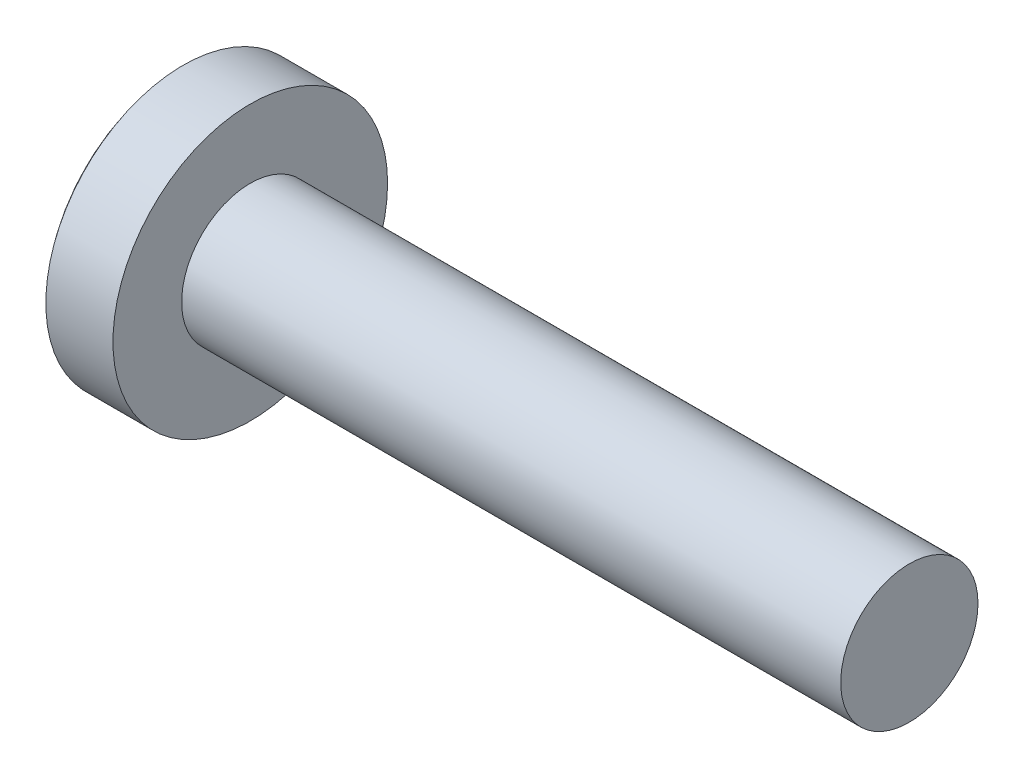
ISO-10303-21;
HEADER;
FILE_DESCRIPTION(('STEP AP214'),'2;1');
FILE_NAME('part.step','',(''),(''),'','','');
FILE_SCHEMA(('AUTOMOTIVE_DESIGN { 1 0 10303 214 1 1 1 1 }'));
ENDSEC;
DATA;
#1=APPLICATION_CONTEXT('core data for automotive mechanical design processes');
#2=APPLICATION_PROTOCOL_DEFINITION('international standard','automotive_design',2000,#1);
#3=PRODUCT_CONTEXT('',#1,'mechanical');
#4=PRODUCT('Part','Part','',(#3));
#5=PRODUCT_RELATED_PRODUCT_CATEGORY('part','',(#4));
#6=PRODUCT_DEFINITION_FORMATION('','',#4);
#7=PRODUCT_DEFINITION_CONTEXT('part definition',#1,'design');
#8=PRODUCT_DEFINITION('design','',#6,#7);
#9=PRODUCT_DEFINITION_SHAPE('','',#8);
#10=(LENGTH_UNIT() NAMED_UNIT(*) SI_UNIT(.MILLI.,.METRE.));
#11=(NAMED_UNIT(*) PLANE_ANGLE_UNIT() SI_UNIT($,.RADIAN.));
#12=(NAMED_UNIT(*) SI_UNIT($,.STERADIAN.) SOLID_ANGLE_UNIT());
#13=UNCERTAINTY_MEASURE_WITH_UNIT(LENGTH_MEASURE(1.E-05),#10,'distance_accuracy_value','');
#14=(GEOMETRIC_REPRESENTATION_CONTEXT(3) GLOBAL_UNCERTAINTY_ASSIGNED_CONTEXT((#13)) GLOBAL_UNIT_ASSIGNED_CONTEXT((#10,
#11,#12)) REPRESENTATION_CONTEXT('',''));
#15=CARTESIAN_POINT('',(0.,0.,0.));
#16=DIRECTION('',(0.,0.,1.));
#17=DIRECTION('',(1.,0.,0.));
#18=AXIS2_PLACEMENT_3D('',#15,#16,#17);
#19=CARTESIAN_POINT('',(1.47,0.27,0.27));
#20=DIRECTION('',(1.,0.,0.));
#21=DIRECTION('',(0.,0.,-1.));
#22=AXIS2_PLACEMENT_3D('',#19,#20,#21);
#23=PLANE('',#22);
#24=CARTESIAN_POINT('',(1.47,0.57,0.57));
#25=DIRECTION('',(-1.,0.,0.));
#26=DIRECTION('',(0.,0.,1.));
#27=AXIS2_PLACEMENT_3D('',#24,#25,#26);
#28=CIRCLE('',#27,0.3);
#29=CARTESIAN_POINT('',(1.47,0.501295104291248,0.277973225019264));
#30=VERTEX_POINT('',#29);
#31=CARTESIAN_POINT('',(1.47,0.277973225019264,0.501295104291247));
#32=VERTEX_POINT('',#31);
#33=EDGE_CURVE('E19',#30,#32,#28,.T.);
#34=ORIENTED_EDGE('',*,*,#33,.F.);
#35=DIRECTION('',(0.,0.,1.));
#36=VECTOR('',#35,1.);
#37=CARTESIAN_POINT('',(1.47,0.501295104291248,0.));
#38=LINE('',#37,#36);
#39=CARTESIAN_POINT('',(1.47,0.501295104291248,-0.277973225019264));
#40=VERTEX_POINT('',#39);
#41=EDGE_CURVE('E129',#40,#30,#38,.T.);
#42=ORIENTED_EDGE('',*,*,#41,.F.);
#43=CARTESIAN_POINT('',(1.47,0.57,-0.57));
#44=DIRECTION('',(-1.,0.,0.));
#45=DIRECTION('',(0.,0.,1.));
#46=AXIS2_PLACEMENT_3D('',#43,#44,#45);
#47=CIRCLE('',#46,0.3);
#48=CARTESIAN_POINT('',(1.47,0.277973225019264,-0.501295104291247));
#49=VERTEX_POINT('',#48);
#50=EDGE_CURVE('E270',#49,#40,#47,.T.);
#51=ORIENTED_EDGE('',*,*,#50,.F.);
#52=DIRECTION('',(0.,1.,0.));
#53=VECTOR('',#52,1.);
#54=CARTESIAN_POINT('',(1.47,0.,-0.501295104291247));
#55=LINE('',#54,#53);
#56=CARTESIAN_POINT('',(1.47,-0.277973225019264,-0.501295104291247));
#57=VERTEX_POINT('',#56);
#58=EDGE_CURVE('E152',#57,#49,#55,.T.);
#59=ORIENTED_EDGE('',*,*,#58,.F.);
#60=CARTESIAN_POINT('',(1.47,-0.57,-0.57));
#61=DIRECTION('',(-1.,0.,0.));
#62=DIRECTION('',(0.,0.,1.));
#63=AXIS2_PLACEMENT_3D('',#60,#61,#62);
#64=CIRCLE('',#63,0.3);
#65=CARTESIAN_POINT('',(1.47,-0.501295104291248,-0.277973225019264));
#66=VERTEX_POINT('',#65);
#67=EDGE_CURVE('E288',#66,#57,#64,.T.);
#68=ORIENTED_EDGE('',*,*,#67,.F.);
#69=DIRECTION('',(0.,0.,1.));
#70=VECTOR('',#69,1.);
#71=CARTESIAN_POINT('',(1.47,-0.501295104291248,0.));
#72=LINE('',#71,#70);
#73=CARTESIAN_POINT('',(1.47,-0.501295104291248,0.277973225019263));
#74=VERTEX_POINT('',#73);
#75=EDGE_CURVE('E157',#74,#66,#72,.F.);
#76=ORIENTED_EDGE('',*,*,#75,.F.);
#77=CARTESIAN_POINT('',(1.47,-0.57,0.57));
#78=DIRECTION('',(-1.,0.,0.));
#79=DIRECTION('',(0.,0.,1.));
#80=AXIS2_PLACEMENT_3D('',#77,#78,#79);
#81=CIRCLE('',#80,0.3);
#82=CARTESIAN_POINT('',(1.47,-0.277973225019264,0.501295104291247));
#83=VERTEX_POINT('',#82);
#84=EDGE_CURVE('E319',#83,#74,#81,.T.);
#85=ORIENTED_EDGE('',*,*,#84,.F.);
#86=DIRECTION('',(0.,1.,0.));
#87=VECTOR('',#86,1.);
#88=CARTESIAN_POINT('',(1.47,0.,0.501295104291247));
#89=LINE('',#88,#87);
#90=EDGE_CURVE('E132',#32,#83,#89,.F.);
#91=ORIENTED_EDGE('',*,*,#90,.F.);
#92=EDGE_LOOP('',(#34,#42,#51,#59,#68,#76,#85,#91));
#93=FACE_BOUND('',#92,.T.);
#94=ADVANCED_FACE('F16',(#93),#23,.F.);
#95=CARTESIAN_POINT('',(1.47,0.57,0.57));
#96=DIRECTION('',(-1.,0.,0.));
#97=DIRECTION('',(0.,0.,1.));
#98=AXIS2_PLACEMENT_3D('',#95,#96,#97);
#99=CYLINDRICAL_SURFACE('',#98,0.3);
#100=DIRECTION('',(1.,0.,0.));
#101=VECTOR('',#100,1.);
#102=CARTESIAN_POINT('',(1.47,0.57,0.27));
#103=LINE('',#102,#101);
#104=CARTESIAN_POINT('',(1.35099962990372,0.57,0.27));
#105=VERTEX_POINT('',#104);
#106=CARTESIAN_POINT('',(0.0500379748660876,0.57,0.27));
#107=VERTEX_POINT('',#106);
#108=EDGE_CURVE('E140',#105,#107,#103,.F.);
#109=ORIENTED_EDGE('',*,*,#108,.F.);
#110=CARTESIAN_POINT('',(1.35099962990372,0.57,0.57));
#111=DIRECTION('',(-0.500000000000001,-0.866025403784438,0.));
#112=DIRECTION('',(-0.866025403784438,0.500000000000001,0.));
#113=AXIS2_PLACEMENT_3D('',#110,#111,#112);
#114=ELLIPSE('',#113,0.599999999999999,0.3);
#115=EDGE_CURVE('E137',#30,#105,#114,.F.);
#116=ORIENTED_EDGE('',*,*,#115,.F.);
#117=ORIENTED_EDGE('',*,*,#33,.T.);
#118=CARTESIAN_POINT('',(1.35099962990372,0.57,0.57));
#119=DIRECTION('',(-0.500000000000001,0.,-0.866025403784438));
#120=DIRECTION('',(-0.866025403784438,0.,0.500000000000001));
#121=AXIS2_PLACEMENT_3D('',#118,#119,#120);
#122=ELLIPSE('',#121,0.599999999999999,0.3);
#123=CARTESIAN_POINT('',(1.35099962990372,0.27,0.57));
#124=VERTEX_POINT('',#123);
#125=EDGE_CURVE('E163',#124,#32,#122,.F.);
#126=ORIENTED_EDGE('',*,*,#125,.F.);
#127=DIRECTION('',(1.,0.,0.));
#128=VECTOR('',#127,1.);
#129=CARTESIAN_POINT('',(1.47,0.27,0.57));
#130=LINE('',#129,#128);
#131=CARTESIAN_POINT('',(0.0500379748660873,0.27,0.57));
#132=VERTEX_POINT('',#131);
#133=EDGE_CURVE('E342',#132,#124,#130,.T.);
#134=ORIENTED_EDGE('',*,*,#133,.F.);
#135=CARTESIAN_POINT('',(0.0500379748660873,0.269999999999999,0.57));
#136=CARTESIAN_POINT('',(0.0476365193072019,0.269985184718192,0.553373133693541));
#137=CARTESIAN_POINT('',(0.0454365535761343,0.27138160203282,0.536716442967316));
#138=CARTESIAN_POINT('',(0.041494524220516,0.276920923649693,0.503814466627408));
#139=CARTESIAN_POINT('',(0.0397523598629176,0.281063223049623,0.487569091221413));
#140=CARTESIAN_POINT('',(0.036778374566567,0.292023459728197,0.455938435457178));
#141=CARTESIAN_POINT('',(0.0355470274058542,0.298843869569156,0.440553964967673));
#142=CARTESIAN_POINT('',(0.0336346249010352,0.314973582618152,0.411119958233408));
#143=CARTESIAN_POINT('',(0.0329533539015006,0.32428190854053,0.397069900744799));
#144=CARTESIAN_POINT('',(0.0321660944268172,0.345013208977959,0.370858942562679));
#145=CARTESIAN_POINT('',(0.0320539196934614,0.356412041876083,0.358679128892844));
#146=CARTESIAN_POINT('',(0.0323915833576585,0.381063919968772,0.336377730121749));
#147=CARTESIAN_POINT('',(0.0328414084664963,0.394316921314189,0.326256096360568));
#148=CARTESIAN_POINT('',(0.0342854793268386,0.422222752109676,0.308399048507583));
#149=CARTESIAN_POINT('',(0.0352770584097557,0.436868437061245,0.30065223410746));
#150=CARTESIAN_POINT('',(0.0377733495233279,0.467195795819664,0.287682728115111));
#151=CARTESIAN_POINT('',(0.0392779218148245,0.482877186563698,0.282459350075276));
#152=CARTESIAN_POINT('',(0.042285712340483,0.51051671287805,0.275710673998405));
#153=CARTESIAN_POINT('',(0.0436802006877333,0.52234038895002,0.273568318144529));
#154=CARTESIAN_POINT('',(0.046694968718835,0.546113272121097,0.270712687134809));
#155=CARTESIAN_POINT('',(0.0483149209970558,0.558062274372233,0.2699973624182));
#156=CARTESIAN_POINT('',(0.0500379748660879,0.57,0.27));
#157=B_SPLINE_CURVE_WITH_KNOTS('',3,(#135,#136,#137,#138,#139,#140,#141,#142,#143,#144,#145,
#146,#147,#148,#149,#150,#151,#152,#153,#154,#155,#156),.UNSPECIFIED.,.F.,.F.,(4,2,2,2,2,2,2,2,
2,2,4),(0.,0.0503402470596834,0.100669408130982,0.151045145210378,0.20140112305631,
0.251208524397358,0.301014748044423,0.35057799141672,0.400127744552092,0.436335022834785,
0.472490261189751),.UNSPECIFIED.);
#158=EDGE_CURVE('E135',#132,#107,#157,.T.);
#159=ORIENTED_EDGE('',*,*,#158,.T.);
#160=EDGE_LOOP('',(#109,#116,#117,#126,#134,#159));
#161=FACE_BOUND('',#160,.T.);
#162=ADVANCED_FACE('F138',(#161),#99,.T.);
#163=CARTESIAN_POINT('',(0.,0.,1.35));
#164=DIRECTION('',(-0.500000000000001,0.,-0.866025403784438));
#165=DIRECTION('',(-0.866025403784438,0.,0.500000000000001));
#166=AXIS2_PLACEMENT_3D('',#163,#164,#165);
#167=PLANE('',#166);
#168=DIRECTION('',(0.866025403784438,0.,-0.500000000000001));
#169=VECTOR('',#168,1.);
#170=CARTESIAN_POINT('',(0.204098003289609,-0.27,1.23216396285968));
#171=LINE('',#170,#169);
#172=CARTESIAN_POINT('',(0.204098003289609,-0.27,1.23216396285968));
#173=VERTEX_POINT('',#172);
#174=CARTESIAN_POINT('',(1.35099962990372,-0.27,0.57));
#175=VERTEX_POINT('',#174);
#176=EDGE_CURVE('E351',#173,#175,#171,.T.);
#177=ORIENTED_EDGE('',*,*,#176,.F.);
#178=CARTESIAN_POINT('',(0.204098003289609,-0.27,1.23216396285968));
#179=CARTESIAN_POINT('',(0.198713172982016,-0.18,1.23527289608731));
#180=CARTESIAN_POINT('',(0.196020757828219,-0.0900000000000002,1.23682736270112));
#181=CARTESIAN_POINT('',(0.196020757828219,0.0899999999999997,1.23682736270112));
#182=CARTESIAN_POINT('',(0.198713172982016,0.18,1.23527289608731));
#183=CARTESIAN_POINT('',(0.204098003289609,0.27,1.23216396285968));
#184=B_SPLINE_CURVE_WITH_KNOTS('',3,(#178,#179,#180,#181,#182,#183),.UNSPECIFIED.,.F.,.F.,(4,2,
4),(0.,0.27016104306936,0.54032208613872),.UNSPECIFIED.);
#185=CARTESIAN_POINT('',(0.204098003289609,0.269999999999999,1.23216396285968));
#186=VERTEX_POINT('',#185);
#187=EDGE_CURVE('E162',#173,#186,#184,.T.);
#188=ORIENTED_EDGE('',*,*,#187,.T.);
#189=DIRECTION('',(-0.866025403784438,0.,0.500000000000001));
#190=VECTOR('',#189,1.);
#191=CARTESIAN_POINT('',(1.35099962990372,0.27,0.57));
#192=LINE('',#191,#190);
#193=EDGE_CURVE('E340',#124,#186,#192,.T.);
#194=ORIENTED_EDGE('',*,*,#193,.F.);
#195=ORIENTED_EDGE('',*,*,#125,.T.);
#196=ORIENTED_EDGE('',*,*,#90,.T.);
#197=CARTESIAN_POINT('',(1.35099962990372,-0.57,0.57));
#198=DIRECTION('',(-0.500000000000001,0.,-0.866025403784438));
#199=DIRECTION('',(-0.866025403784438,0.,0.500000000000001));
#200=AXIS2_PLACEMENT_3D('',#197,#198,#199);
#201=ELLIPSE('',#200,0.599999999999999,0.3);
#202=EDGE_CURVE('E310',#175,#83,#201,.T.);
#203=ORIENTED_EDGE('',*,*,#202,.F.);
#204=EDGE_LOOP('',(#177,#188,#194,#195,#196,#203));
#205=FACE_BOUND('',#204,.T.);
#206=ADVANCED_FACE('F326',(#205),#167,.T.);
#207=CARTESIAN_POINT('',(1.47,-0.57,0.57));
#208=DIRECTION('',(-1.,0.,0.));
#209=DIRECTION('',(0.,0.,1.));
#210=AXIS2_PLACEMENT_3D('',#207,#208,#209);
#211=CYLINDRICAL_SURFACE('',#210,0.3);
#212=DIRECTION('',(1.,0.,0.));
#213=VECTOR('',#212,1.);
#214=CARTESIAN_POINT('',(1.47,-0.27,0.57));
#215=LINE('',#214,#213);
#216=CARTESIAN_POINT('',(0.0500379748660873,-0.27,0.57));
#217=VERTEX_POINT('',#216);
#218=EDGE_CURVE('E354',#175,#217,#215,.F.);
#219=ORIENTED_EDGE('',*,*,#218,.F.);
#220=ORIENTED_EDGE('',*,*,#202,.T.);
#221=ORIENTED_EDGE('',*,*,#84,.T.);
#222=CARTESIAN_POINT('',(1.35099962990372,-0.57,0.57));
#223=DIRECTION('',(-0.500000000000001,0.866025403784438,0.));
#224=DIRECTION('',(-0.866025403784438,-0.500000000000001,0.));
#225=AXIS2_PLACEMENT_3D('',#222,#223,#224);
#226=ELLIPSE('',#225,0.599999999999999,0.3);
#227=CARTESIAN_POINT('',(1.35099962990372,-0.57,0.27));
#228=VERTEX_POINT('',#227);
#229=EDGE_CURVE('E161',#228,#74,#226,.F.);
#230=ORIENTED_EDGE('',*,*,#229,.F.);
#231=DIRECTION('',(1.,0.,0.));
#232=VECTOR('',#231,1.);
#233=CARTESIAN_POINT('',(1.47,-0.57,0.27));
#234=LINE('',#233,#232);
#235=CARTESIAN_POINT('',(0.0500379748660876,-0.57,0.27));
#236=VERTEX_POINT('',#235);
#237=EDGE_CURVE('E357',#236,#228,#234,.T.);
#238=ORIENTED_EDGE('',*,*,#237,.F.);
#239=CARTESIAN_POINT('',(0.0500379748660879,-0.57,0.27));
#240=CARTESIAN_POINT('',(0.0476365193072021,-0.55337313369354,0.269985184718192));
#241=CARTESIAN_POINT('',(0.0454365535761344,-0.536716442967315,0.27138160203282));
#242=CARTESIAN_POINT('',(0.0414945242205159,-0.503814466627406,0.276920923649694));
#243=CARTESIAN_POINT('',(0.0397523598629175,-0.487569091221411,0.281063223049624));
#244=CARTESIAN_POINT('',(0.0367783745665669,-0.455938435457174,0.292023459728199));
#245=CARTESIAN_POINT('',(0.0355470274058541,-0.44055396496767,0.298843869569159));
#246=CARTESIAN_POINT('',(0.0336346249010354,-0.411119958233403,0.314973582618155));
#247=CARTESIAN_POINT('',(0.0329533539015011,-0.397069900744794,0.324281908540532));
#248=CARTESIAN_POINT('',(0.0321660944268181,-0.370858942562674,0.345013208977963));
#249=CARTESIAN_POINT('',(0.0320539196934625,-0.358679128892839,0.356412041876088));
#250=CARTESIAN_POINT('',(0.0323915833576594,-0.336377730121745,0.381063919968778));
#251=CARTESIAN_POINT('',(0.032841408466497,-0.326256096360564,0.394316921314194));
#252=CARTESIAN_POINT('',(0.0342854793268389,-0.30839904850758,0.422222752109682));
#253=CARTESIAN_POINT('',(0.035277058409756,-0.300652234107458,0.436868437061251));
#254=CARTESIAN_POINT('',(0.0377733495233278,-0.287682728115109,0.46719579581967));
#255=CARTESIAN_POINT('',(0.0392779218148239,-0.282459350075273,0.482877186563704));
#256=CARTESIAN_POINT('',(0.042285712340483,-0.275710673998403,0.510516712878054));
#257=CARTESIAN_POINT('',(0.043680200687734,-0.273568318144528,0.522340388950024));
#258=CARTESIAN_POINT('',(0.0466949687188361,-0.270712687134809,0.546113272121098));
#259=CARTESIAN_POINT('',(0.0483149209970566,-0.269997362418201,0.558062274372234));
#260=CARTESIAN_POINT('',(0.0500379748660873,-0.27,0.57));
#261=B_SPLINE_CURVE_WITH_KNOTS('',3,(#239,#240,#241,#242,#243,#244,#245,#246,#247,#248,#249,
#250,#251,#252,#253,#254,#255,#256,#257,#258,#259,#260),.UNSPECIFIED.,.F.,.F.,(4,2,2,2,2,2,2,2,
2,2,4),(0.,0.050340247059685,0.100669408130986,0.151045145210383,0.201401123056317,
0.251208524397365,0.30101474804443,0.350577991416726,0.400127744552098,0.436335022834789,
0.472490261189751),.UNSPECIFIED.);
#262=EDGE_CURVE('E313',#236,#217,#261,.T.);
#263=ORIENTED_EDGE('',*,*,#262,.T.);
#264=EDGE_LOOP('',(#219,#220,#221,#230,#238,#263));
#265=FACE_BOUND('',#264,.T.);
#266=ADVANCED_FACE('F299',(#265),#211,.T.);
#267=CARTESIAN_POINT('',(0.,-1.35,0.));
#268=DIRECTION('',(-0.500000000000001,0.866025403784438,0.));
#269=DIRECTION('',(-0.866025403784438,-0.500000000000001,0.));
#270=AXIS2_PLACEMENT_3D('',#267,#268,#269);
#271=PLANE('',#270);
#272=DIRECTION('',(0.866025403784438,0.500000000000001,0.));
#273=VECTOR('',#272,1.);
#274=CARTESIAN_POINT('',(0.204098003289609,-1.23216396285968,-0.27));
#275=LINE('',#274,#273);
#276=CARTESIAN_POINT('',(0.204098003289609,-1.23216396285968,-0.270000000000001));
#277=VERTEX_POINT('',#276);
#278=CARTESIAN_POINT('',(1.35099962990372,-0.57,-0.27));
#279=VERTEX_POINT('',#278);
#280=EDGE_CURVE('E363',#277,#279,#275,.T.);
#281=ORIENTED_EDGE('',*,*,#280,.F.);
#282=CARTESIAN_POINT('',(0.20409800328961,-1.23216396285968,-0.270000000000002));
#283=CARTESIAN_POINT('',(0.198713172982015,-1.2352728960873,-0.180000000000001));
#284=CARTESIAN_POINT('',(0.196020757828219,-1.23682736270112,-0.0900000000000005));
#285=CARTESIAN_POINT('',(0.196020757828222,-1.23682736270113,0.0900000000000011));
#286=CARTESIAN_POINT('',(0.198713172982022,-1.23527289608732,0.180000000000002));
#287=CARTESIAN_POINT('',(0.20409800328962,-1.2321639628597,0.270000000000003));
#288=B_SPLINE_CURVE_WITH_KNOTS('',3,(#282,#283,#284,#285,#286,#287),.UNSPECIFIED.,.F.,.F.,(4,2,
4),(0.,0.270161043069362,0.540322086138725),.UNSPECIFIED.);
#289=CARTESIAN_POINT('',(0.204098003289609,-1.23216396285968,0.269999999999999));
#290=VERTEX_POINT('',#289);
#291=EDGE_CURVE('E160',#277,#290,#288,.T.);
#292=ORIENTED_EDGE('',*,*,#291,.T.);
#293=DIRECTION('',(-0.866025403784438,-0.500000000000001,0.));
#294=VECTOR('',#293,1.);
#295=CARTESIAN_POINT('',(1.35099962990372,-0.57,0.27));
#296=LINE('',#295,#294);
#297=EDGE_CURVE('E360',#228,#290,#296,.T.);
#298=ORIENTED_EDGE('',*,*,#297,.F.);
#299=ORIENTED_EDGE('',*,*,#229,.T.);
#300=ORIENTED_EDGE('',*,*,#75,.T.);
#301=CARTESIAN_POINT('',(1.35099962990372,-0.57,-0.57));
#302=DIRECTION('',(-0.500000000000001,0.866025403784438,0.));
#303=DIRECTION('',(-0.866025403784438,-0.500000000000001,0.));
#304=AXIS2_PLACEMENT_3D('',#301,#302,#303);
#305=ELLIPSE('',#304,0.599999999999999,0.3);
#306=EDGE_CURVE('E279',#279,#66,#305,.T.);
#307=ORIENTED_EDGE('',*,*,#306,.F.);
#308=EDGE_LOOP('',(#281,#292,#298,#299,#300,#307));
#309=FACE_BOUND('',#308,.T.);
#310=ADVANCED_FACE('F294',(#309),#271,.T.);
#311=CARTESIAN_POINT('',(1.47,-0.57,-0.57));
#312=DIRECTION('',(-1.,0.,0.));
#313=DIRECTION('',(0.,0.,1.));
#314=AXIS2_PLACEMENT_3D('',#311,#312,#313);
#315=CYLINDRICAL_SURFACE('',#314,0.3);
#316=DIRECTION('',(1.,0.,0.));
#317=VECTOR('',#316,1.);
#318=CARTESIAN_POINT('',(1.47,-0.57,-0.27));
#319=LINE('',#318,#317);
#320=CARTESIAN_POINT('',(0.0500379748660876,-0.57,-0.269999999999999));
#321=VERTEX_POINT('',#320);
#322=EDGE_CURVE('E366',#279,#321,#319,.F.);
#323=ORIENTED_EDGE('',*,*,#322,.F.);
#324=ORIENTED_EDGE('',*,*,#306,.T.);
#325=ORIENTED_EDGE('',*,*,#67,.T.);
#326=CARTESIAN_POINT('',(1.35099962990372,-0.57,-0.57));
#327=DIRECTION('',(-0.500000000000001,0.,0.866025403784438));
#328=DIRECTION('',(-0.866025403784438,0.,-0.500000000000001));
#329=AXIS2_PLACEMENT_3D('',#326,#327,#328);
#330=ELLIPSE('',#329,0.599999999999999,0.3);
#331=CARTESIAN_POINT('',(1.35099962990372,-0.27,-0.57));
#332=VERTEX_POINT('',#331);
#333=EDGE_CURVE('E156',#332,#57,#330,.F.);
#334=ORIENTED_EDGE('',*,*,#333,.F.);
#335=DIRECTION('',(1.,0.,0.));
#336=VECTOR('',#335,1.);
#337=CARTESIAN_POINT('',(1.47,-0.27,-0.57));
#338=LINE('',#337,#336);
#339=CARTESIAN_POINT('',(0.0500379748660873,-0.27,-0.57));
#340=VERTEX_POINT('',#339);
#341=EDGE_CURVE('E369',#340,#332,#338,.T.);
#342=ORIENTED_EDGE('',*,*,#341,.F.);
#343=CARTESIAN_POINT('',(0.0500379748660873,-0.27,-0.57));
#344=CARTESIAN_POINT('',(0.0476365193072022,-0.269985184718193,-0.55337313369354));
#345=CARTESIAN_POINT('',(0.0454365535761345,-0.271381602032821,-0.536716442967315));
#346=CARTESIAN_POINT('',(0.0414945242205158,-0.276920923649694,-0.503814466627407));
#347=CARTESIAN_POINT('',(0.0397523598629172,-0.281063223049624,-0.487569091221412));
#348=CARTESIAN_POINT('',(0.0367783745665666,-0.292023459728197,-0.455938435457177));
#349=CARTESIAN_POINT('',(0.0355470274058541,-0.298843869569157,-0.440553964967672));
#350=CARTESIAN_POINT('',(0.0336346249010354,-0.314973582618153,-0.411119958233408));
#351=CARTESIAN_POINT('',(0.0329533539015008,-0.324281908540531,-0.397069900744799));
#352=CARTESIAN_POINT('',(0.0321660944268171,-0.345013208977961,-0.370858942562678));
#353=CARTESIAN_POINT('',(0.0320539196934611,-0.356412041876085,-0.358679128892843));
#354=CARTESIAN_POINT('',(0.0323915833576587,-0.381063919968774,-0.336377730121748));
#355=CARTESIAN_POINT('',(0.0328414084664972,-0.394316921314191,-0.326256096360567));
#356=CARTESIAN_POINT('',(0.0342854793268394,-0.422222752109678,-0.308399048507582));
#357=CARTESIAN_POINT('',(0.0352770584097559,-0.436868437061247,-0.300652234107459));
#358=CARTESIAN_POINT('',(0.0377733495233277,-0.467195795819665,-0.287682728115112));
#359=CARTESIAN_POINT('',(0.0392779218148245,-0.4828771865637,-0.282459350075278));
#360=CARTESIAN_POINT('',(0.042285712340483,-0.510516712878051,-0.275710673998406));
#361=CARTESIAN_POINT('',(0.0436802006877333,-0.522340388950022,-0.27356831814453));
#362=CARTESIAN_POINT('',(0.0466949687188349,-0.546113272121098,-0.270712687134808));
#363=CARTESIAN_POINT('',(0.0483149209970557,-0.558062274372234,-0.269997362418198));
#364=CARTESIAN_POINT('',(0.0500379748660879,-0.570000000000001,-0.269999999999998));
#365=B_SPLINE_CURVE_WITH_KNOTS('',3,(#343,#344,#345,#346,#347,#348,#349,#350,#351,#352,#353,
#354,#355,#356,#357,#358,#359,#360,#361,#362,#363,#364),.UNSPECIFIED.,.F.,.F.,(4,2,2,2,2,2,2,2,
2,2,4),(0.,0.0503402470596843,0.100669408130984,0.151045145210379,0.201401123056311,
0.25120852439736,0.301014748044425,0.35057799141672,0.400127744552093,0.436335022834786,
0.472490261189751),.UNSPECIFIED.);
#366=EDGE_CURVE('E282',#340,#321,#365,.T.);
#367=ORIENTED_EDGE('',*,*,#366,.T.);
#368=EDGE_LOOP('',(#323,#324,#325,#334,#342,#367));
#369=FACE_BOUND('',#368,.T.);
#370=ADVANCED_FACE('F290',(#369),#315,.T.);
#371=CARTESIAN_POINT('',(0.,0.,-1.35));
#372=DIRECTION('',(-0.500000000000001,0.,0.866025403784438));
#373=DIRECTION('',(0.866025403784438,0.,0.500000000000001));
#374=AXIS2_PLACEMENT_3D('',#371,#372,#373);
#375=PLANE('',#374);
#376=DIRECTION('',(0.866025403784438,0.,0.500000000000001));
#377=VECTOR('',#376,1.);
#378=CARTESIAN_POINT('',(0.204098003289609,0.27,-1.23216396285968));
#379=LINE('',#378,#377);
#380=CARTESIAN_POINT('',(0.204098003289609,0.270000000000001,-1.23216396285968));
#381=VERTEX_POINT('',#380);
#382=CARTESIAN_POINT('',(1.35099962990372,0.27,-0.57));
#383=VERTEX_POINT('',#382);
#384=EDGE_CURVE('E375',#381,#383,#379,.T.);
#385=ORIENTED_EDGE('',*,*,#384,.F.);
#386=CARTESIAN_POINT('',(0.204098003289608,0.270000000000001,-1.23216396285968));
#387=CARTESIAN_POINT('',(0.198713172982016,0.18,-1.23527289608731));
#388=CARTESIAN_POINT('',(0.196020757828219,0.0900000000000003,-1.23682736270112));
#389=CARTESIAN_POINT('',(0.196020757828219,-0.0899999999999999,-1.23682736270112));
#390=CARTESIAN_POINT('',(0.198713172982015,-0.18,-1.23527289608731));
#391=CARTESIAN_POINT('',(0.204098003289608,-0.27,-1.23216396285968));
#392=B_SPLINE_CURVE_WITH_KNOTS('',3,(#386,#387,#388,#389,#390,#391),.UNSPECIFIED.,.F.,.F.,(4,2,
4),(0.,0.270161043069361,0.540322086138721),.UNSPECIFIED.);
#393=CARTESIAN_POINT('',(0.204098003289609,-0.27,-1.23216396285968));
#394=VERTEX_POINT('',#393);
#395=EDGE_CURVE('E155',#381,#394,#392,.T.);
#396=ORIENTED_EDGE('',*,*,#395,.T.);
#397=DIRECTION('',(-0.866025403784438,0.,-0.500000000000001));
#398=VECTOR('',#397,1.);
#399=CARTESIAN_POINT('',(1.35099962990372,-0.27,-0.57));
#400=LINE('',#399,#398);
#401=EDGE_CURVE('E372',#332,#394,#400,.T.);
#402=ORIENTED_EDGE('',*,*,#401,.F.);
#403=ORIENTED_EDGE('',*,*,#333,.T.);
#404=ORIENTED_EDGE('',*,*,#58,.T.);
#405=CARTESIAN_POINT('',(1.35099962990372,0.57,-0.57));
#406=DIRECTION('',(-0.500000000000001,0.,0.866025403784438));
#407=DIRECTION('',(-0.866025403784438,0.,-0.500000000000001));
#408=AXIS2_PLACEMENT_3D('',#405,#406,#407);
#409=ELLIPSE('',#408,0.599999999999999,0.3);
#410=EDGE_CURVE('E146',#383,#49,#409,.T.);
#411=ORIENTED_EDGE('',*,*,#410,.F.);
#412=EDGE_LOOP('',(#385,#396,#402,#403,#404,#411));
#413=FACE_BOUND('',#412,.T.);
#414=ADVANCED_FACE('F258',(#413),#375,.T.);
#415=CARTESIAN_POINT('',(1.47,0.57,-0.57));
#416=DIRECTION('',(-1.,0.,0.));
#417=DIRECTION('',(0.,0.,1.));
#418=AXIS2_PLACEMENT_3D('',#415,#416,#417);
#419=CYLINDRICAL_SURFACE('',#418,0.3);
#420=DIRECTION('',(1.,0.,0.));
#421=VECTOR('',#420,1.);
#422=CARTESIAN_POINT('',(1.47,0.27,-0.57));
#423=LINE('',#422,#421);
#424=CARTESIAN_POINT('',(0.0500379748660873,0.27,-0.57));
#425=VERTEX_POINT('',#424);
#426=EDGE_CURVE('E378',#383,#425,#423,.F.);
#427=ORIENTED_EDGE('',*,*,#426,.F.);
#428=ORIENTED_EDGE('',*,*,#410,.T.);
#429=ORIENTED_EDGE('',*,*,#50,.T.);
#430=CARTESIAN_POINT('',(1.35099962990372,0.57,-0.57));
#431=DIRECTION('',(-0.500000000000001,-0.866025403784438,0.));
#432=DIRECTION('',(-0.866025403784438,0.500000000000001,0.));
#433=AXIS2_PLACEMENT_3D('',#430,#431,#432);
#434=ELLIPSE('',#433,0.599999999999999,0.3);
#435=CARTESIAN_POINT('',(1.35099962990372,0.57,-0.27));
#436=VERTEX_POINT('',#435);
#437=EDGE_CURVE('E144',#436,#40,#434,.F.);
#438=ORIENTED_EDGE('',*,*,#437,.F.);
#439=DIRECTION('',(1.,0.,0.));
#440=VECTOR('',#439,1.);
#441=CARTESIAN_POINT('',(1.47,0.57,-0.27));
#442=LINE('',#441,#440);
#443=CARTESIAN_POINT('',(0.0500379748660876,0.57,-0.269999999999999));
#444=VERTEX_POINT('',#443);
#445=EDGE_CURVE('E381',#444,#436,#442,.T.);
#446=ORIENTED_EDGE('',*,*,#445,.F.);
#447=CARTESIAN_POINT('',(0.0500379748660879,0.57,-0.269999999999998));
#448=CARTESIAN_POINT('',(0.0476365193072021,0.55337313369354,-0.269985184718191));
#449=CARTESIAN_POINT('',(0.0454365535761343,0.536716442967316,-0.27138160203282));
#450=CARTESIAN_POINT('',(0.0414945242205158,0.503814466627407,-0.276920923649695));
#451=CARTESIAN_POINT('',(0.0397523598629175,0.487569091221411,-0.281063223049626));
#452=CARTESIAN_POINT('',(0.036778374566567,0.455938435457175,-0.2920234597282));
#453=CARTESIAN_POINT('',(0.0355470274058542,0.44055396496767,-0.29884386956916));
#454=CARTESIAN_POINT('',(0.0336346249010353,0.411119958233404,-0.314973582618154));
#455=CARTESIAN_POINT('',(0.0329533539015007,0.397069900744794,-0.324281908540531));
#456=CARTESIAN_POINT('',(0.0321660944268176,0.370858942562673,-0.345013208977961));
#457=CARTESIAN_POINT('',(0.0320539196934623,0.358679128892839,-0.356412041876087));
#458=CARTESIAN_POINT('',(0.0323915833576596,0.336377730121746,-0.381063919968778));
#459=CARTESIAN_POINT('',(0.0328414084664973,0.326256096360565,-0.394316921314196));
#460=CARTESIAN_POINT('',(0.0342854793268396,0.308399048507581,-0.422222752109684));
#461=CARTESIAN_POINT('',(0.035277058409757,0.300652234107458,-0.436868437061252));
#462=CARTESIAN_POINT('',(0.0377733495233285,0.287682728115109,-0.46719579581967));
#463=CARTESIAN_POINT('',(0.0392779218148241,0.282459350075274,-0.482877186563704));
#464=CARTESIAN_POINT('',(0.0422857123404829,0.275710673998403,-0.510516712878054));
#465=CARTESIAN_POINT('',(0.0436802006877339,0.273568318144529,-0.522340388950023));
#466=CARTESIAN_POINT('',(0.0466949687188361,0.270712687134809,-0.546113272121098));
#467=CARTESIAN_POINT('',(0.0483149209970568,0.2699973624182,-0.558062274372233));
#468=CARTESIAN_POINT('',(0.0500379748660873,0.269999999999999,-0.57));
#469=B_SPLINE_CURVE_WITH_KNOTS('',3,(#447,#448,#449,#450,#451,#452,#453,#454,#455,#456,#457,
#458,#459,#460,#461,#462,#463,#464,#465,#466,#467,#468),.UNSPECIFIED.,.F.,.F.,(4,2,2,2,2,2,2,2,
2,2,4),(0.,0.0503402470596844,0.100669408130986,0.151045145210383,0.201401123056316,
0.251208524397365,0.301014748044431,0.350577991416726,0.400127744552097,0.436335022834788,
0.47249026118975),.UNSPECIFIED.);
#470=EDGE_CURVE('E263',#444,#425,#469,.T.);
#471=ORIENTED_EDGE('',*,*,#470,.T.);
#472=EDGE_LOOP('',(#427,#428,#429,#438,#446,#471));
#473=FACE_BOUND('',#472,.T.);
#474=ADVANCED_FACE('F254',(#473),#419,.T.);
#475=CARTESIAN_POINT('',(0.,1.35,0.));
#476=DIRECTION('',(-0.500000000000001,-0.866025403784438,0.));
#477=DIRECTION('',(0.866025403784438,-0.500000000000001,0.));
#478=AXIS2_PLACEMENT_3D('',#475,#476,#477);
#479=PLANE('',#478);
#480=DIRECTION('',(0.866025403784438,-0.500000000000001,0.));
#481=VECTOR('',#480,1.);
#482=CARTESIAN_POINT('',(0.204098003289609,1.23216396285968,0.27));
#483=LINE('',#482,#481);
#484=CARTESIAN_POINT('',(0.204098003289609,1.23216396285968,0.27));
#485=VERTEX_POINT('',#484);
#486=EDGE_CURVE('E150',#485,#105,#483,.T.);
#487=ORIENTED_EDGE('',*,*,#486,.F.);
#488=CARTESIAN_POINT('',(0.20409800328961,1.23216396285968,0.27));
#489=CARTESIAN_POINT('',(0.198713172982015,1.2352728960873,0.18));
#490=CARTESIAN_POINT('',(0.196020757828219,1.23682736270112,0.09));
#491=CARTESIAN_POINT('',(0.196020757828222,1.23682736270113,-0.0900000000000026));
#492=CARTESIAN_POINT('',(0.198713172982022,1.23527289608732,-0.180000000000005));
#493=CARTESIAN_POINT('',(0.20409800328962,1.2321639628597,-0.270000000000008));
#494=B_SPLINE_CURVE_WITH_KNOTS('',3,(#488,#489,#490,#491,#492,#493),.UNSPECIFIED.,.F.,.F.,(4,2,
4),(0.,0.27016104306936,0.540322086138729),.UNSPECIFIED.);
#495=CARTESIAN_POINT('',(0.204098003289609,1.23216396285968,-0.270000000000001));
#496=VERTEX_POINT('',#495);
#497=EDGE_CURVE('E34',#485,#496,#494,.T.);
#498=ORIENTED_EDGE('',*,*,#497,.T.);
#499=DIRECTION('',(-0.866025403784438,0.500000000000001,0.));
#500=VECTOR('',#499,1.);
#501=CARTESIAN_POINT('',(1.35099962990372,0.57,-0.27));
#502=LINE('',#501,#500);
#503=EDGE_CURVE('E239',#436,#496,#502,.T.);
#504=ORIENTED_EDGE('',*,*,#503,.F.);
#505=ORIENTED_EDGE('',*,*,#437,.T.);
#506=ORIENTED_EDGE('',*,*,#41,.T.);
#507=ORIENTED_EDGE('',*,*,#115,.T.);
#508=EDGE_LOOP('',(#487,#498,#504,#505,#506,#507));
#509=FACE_BOUND('',#508,.T.);
#510=ADVANCED_FACE('F143',(#509),#479,.T.);
#511=CARTESIAN_POINT('',(1.47,0.27,0.27));
#512=DIRECTION('',(0.,0.,-1.));
#513=DIRECTION('',(0.,1.,0.));
#514=AXIS2_PLACEMENT_3D('',#511,#512,#513);
#515=PLANE('',#514);
#516=ORIENTED_EDGE('',*,*,#108,.T.);
#517=CARTESIAN_POINT('',(0.20409800328961,1.23216396285968,0.27));
#518=CARTESIAN_POINT('',(0.169004199271526,1.12399430612169,0.270000000000004));
#519=CARTESIAN_POINT('',(0.138618961560524,1.01472914751439,0.270000000000003));
#520=CARTESIAN_POINT('',(0.0872656187526844,0.794007826561177,0.269999999999996));
#521=CARTESIAN_POINT('',(0.0662975136558463,0.682551664215258,0.269999999999989));
#522=CARTESIAN_POINT('',(0.0500379748660901,0.570000000000027,0.269999999999979));
#523=B_SPLINE_CURVE_WITH_KNOTS('',3,(#517,#518,#519,#520,#521,#522),.UNSPECIFIED.,.F.,.F.,(4,2,
4),(0.,0.340234092950851,0.680468185901701),.UNSPECIFIED.);
#524=EDGE_CURVE('E231',#485,#107,#523,.T.);
#525=ORIENTED_EDGE('',*,*,#524,.F.);
#526=ORIENTED_EDGE('',*,*,#486,.T.);
#527=EDGE_LOOP('',(#516,#525,#526));
#528=FACE_BOUND('',#527,.T.);
#529=ADVANCED_FACE('F245',(#528),#515,.T.);
#530=CARTESIAN_POINT('',(1.47,0.27,0.27));
#531=DIRECTION('',(0.,-1.,0.));
#532=DIRECTION('',(0.,0.,-1.));
#533=AXIS2_PLACEMENT_3D('',#530,#531,#532);
#534=PLANE('',#533);
#535=ORIENTED_EDGE('',*,*,#133,.T.);
#536=ORIENTED_EDGE('',*,*,#193,.T.);
#537=CARTESIAN_POINT('',(4.,0.27,0.));
#538=DIRECTION('',(0.,1.,0.));
#539=DIRECTION('',(0.,0.,1.));
#540=AXIS2_PLACEMENT_3D('',#537,#538,#539);
#541=CIRCLE('',#540,3.99087709657915);
#542=EDGE_CURVE('E228',#132,#186,#541,.T.);
#543=ORIENTED_EDGE('',*,*,#542,.F.);
#544=EDGE_LOOP('',(#535,#536,#543));
#545=FACE_BOUND('',#544,.T.);
#546=ADVANCED_FACE('F249',(#545),#534,.T.);
#547=CARTESIAN_POINT('',(1.47,-0.27,0.27));
#548=DIRECTION('',(0.,1.,0.));
#549=DIRECTION('',(0.,0.,1.));
#550=AXIS2_PLACEMENT_3D('',#547,#548,#549);
#551=PLANE('',#550);
#552=ORIENTED_EDGE('',*,*,#218,.T.);
#553=CARTESIAN_POINT('',(4.,-0.27,0.));
#554=DIRECTION('',(0.,1.,0.));
#555=DIRECTION('',(0.,0.,1.));
#556=AXIS2_PLACEMENT_3D('',#553,#554,#555);
#557=CIRCLE('',#556,3.99087709657915);
#558=EDGE_CURVE('E225',#173,#217,#557,.F.);
#559=ORIENTED_EDGE('',*,*,#558,.F.);
#560=ORIENTED_EDGE('',*,*,#176,.T.);
#561=EDGE_LOOP('',(#552,#559,#560));
#562=FACE_BOUND('',#561,.T.);
#563=ADVANCED_FACE('F407',(#562),#551,.T.);
#564=CARTESIAN_POINT('',(1.47,-0.27,0.27));
#565=DIRECTION('',(0.,0.,-1.));
#566=DIRECTION('',(0.,1.,0.));
#567=AXIS2_PLACEMENT_3D('',#564,#565,#566);
#568=PLANE('',#567);
#569=ORIENTED_EDGE('',*,*,#237,.T.);
#570=ORIENTED_EDGE('',*,*,#297,.T.);
#571=CARTESIAN_POINT('',(0.0500379748660879,-0.57,0.27));
#572=CARTESIAN_POINT('',(0.066297513655843,-0.682551664215235,0.27));
#573=CARTESIAN_POINT('',(0.0872656187526806,-0.79400782656116,0.27));
#574=CARTESIAN_POINT('',(0.138618961560521,-1.01472914751439,0.269999999999999));
#575=CARTESIAN_POINT('',(0.169004199271524,-1.12399430612169,0.269999999999999));
#576=CARTESIAN_POINT('',(0.20409800328961,-1.23216396285968,0.269999999999999));
#577=B_SPLINE_CURVE_WITH_KNOTS('',3,(#571,#572,#573,#574,#575,#576),.UNSPECIFIED.,.F.,.F.,(4,2,
4),(0.,0.340234092950865,0.680468185901729),.UNSPECIFIED.);
#578=EDGE_CURVE('E218',#236,#290,#577,.T.);
#579=ORIENTED_EDGE('',*,*,#578,.F.);
#580=EDGE_LOOP('',(#569,#570,#579));
#581=FACE_BOUND('',#580,.T.);
#582=ADVANCED_FACE('F205',(#581),#568,.T.);
#583=CARTESIAN_POINT('',(1.47,-0.27,-0.27));
#584=DIRECTION('',(0.,0.,1.));
#585=DIRECTION('',(0.,-1.,0.));
#586=AXIS2_PLACEMENT_3D('',#583,#584,#585);
#587=PLANE('',#586);
#588=ORIENTED_EDGE('',*,*,#322,.T.);
#589=CARTESIAN_POINT('',(0.20409800328961,-1.23216396285968,-0.270000000000002));
#590=CARTESIAN_POINT('',(0.169004199271526,-1.12399430612169,-0.270000000000005));
#591=CARTESIAN_POINT('',(0.138618961560524,-1.01472914751439,-0.270000000000004));
#592=CARTESIAN_POINT('',(0.0872656187526844,-0.794007826561177,-0.269999999999996));
#593=CARTESIAN_POINT('',(0.0662975136558461,-0.682551664215258,-0.269999999999989));
#594=CARTESIAN_POINT('',(0.0500379748660896,-0.570000000000027,-0.269999999999978));
#595=B_SPLINE_CURVE_WITH_KNOTS('',3,(#589,#590,#591,#592,#593,#594),.UNSPECIFIED.,.F.,.F.,(4,2,
4),(0.,0.340234092950851,0.680468185901702),.UNSPECIFIED.);
#596=EDGE_CURVE('E210',#277,#321,#595,.T.);
#597=ORIENTED_EDGE('',*,*,#596,.F.);
#598=ORIENTED_EDGE('',*,*,#280,.T.);
#599=EDGE_LOOP('',(#588,#597,#598));
#600=FACE_BOUND('',#599,.T.);
#601=ADVANCED_FACE('F200',(#600),#587,.T.);
#602=CARTESIAN_POINT('',(1.47,-0.27,-0.27));
#603=DIRECTION('',(0.,1.,0.));
#604=DIRECTION('',(0.,0.,1.));
#605=AXIS2_PLACEMENT_3D('',#602,#603,#604);
#606=PLANE('',#605);
#607=ORIENTED_EDGE('',*,*,#341,.T.);
#608=ORIENTED_EDGE('',*,*,#401,.T.);
#609=CARTESIAN_POINT('',(4.,-0.27,0.));
#610=DIRECTION('',(0.,1.,0.));
#611=DIRECTION('',(0.,0.,1.));
#612=AXIS2_PLACEMENT_3D('',#609,#610,#611);
#613=CIRCLE('',#612,3.99087709657915);
#614=EDGE_CURVE('E217',#340,#394,#613,.F.);
#615=ORIENTED_EDGE('',*,*,#614,.F.);
#616=EDGE_LOOP('',(#607,#608,#615));
#617=FACE_BOUND('',#616,.T.);
#618=ADVANCED_FACE('F196',(#617),#606,.T.);
#619=CARTESIAN_POINT('',(1.47,0.27,-0.27));
#620=DIRECTION('',(0.,-1.,0.));
#621=DIRECTION('',(0.,0.,-1.));
#622=AXIS2_PLACEMENT_3D('',#619,#620,#621);
#623=PLANE('',#622);
#624=ORIENTED_EDGE('',*,*,#426,.T.);
#625=CARTESIAN_POINT('',(4.,0.270000000000001,0.));
#626=DIRECTION('',(0.,1.,0.));
#627=DIRECTION('',(0.,0.,1.));
#628=AXIS2_PLACEMENT_3D('',#625,#626,#627);
#629=CIRCLE('',#628,3.99087709657915);
#630=EDGE_CURVE('E182',#381,#425,#629,.T.);
#631=ORIENTED_EDGE('',*,*,#630,.F.);
#632=ORIENTED_EDGE('',*,*,#384,.T.);
#633=EDGE_LOOP('',(#624,#631,#632));
#634=FACE_BOUND('',#633,.T.);
#635=ADVANCED_FACE('F192',(#634),#623,.T.);
#636=CARTESIAN_POINT('',(1.47,0.27,-0.27));
#637=DIRECTION('',(0.,0.,1.));
#638=DIRECTION('',(0.,-1.,0.));
#639=AXIS2_PLACEMENT_3D('',#636,#637,#638);
#640=PLANE('',#639);
#641=ORIENTED_EDGE('',*,*,#445,.T.);
#642=ORIENTED_EDGE('',*,*,#503,.T.);
#643=CARTESIAN_POINT('',(0.0500379748660879,0.57,-0.269999999999998));
#644=CARTESIAN_POINT('',(0.066297513655843,0.682551664215235,-0.269999999999999));
#645=CARTESIAN_POINT('',(0.0872656187526808,0.794007826561159,-0.27));
#646=CARTESIAN_POINT('',(0.138618961560521,1.01472914751439,-0.270000000000001));
#647=CARTESIAN_POINT('',(0.169004199271524,1.12399430612169,-0.270000000000001));
#648=CARTESIAN_POINT('',(0.20409800328961,1.23216396285968,-0.270000000000002));
#649=B_SPLINE_CURVE_WITH_KNOTS('',3,(#643,#644,#645,#646,#647,#648),.UNSPECIFIED.,.F.,.F.,(4,2,
4),(0.,0.340234092950864,0.680468185901729),.UNSPECIFIED.);
#650=EDGE_CURVE('E173',#444,#496,#649,.T.);
#651=ORIENTED_EDGE('',*,*,#650,.F.);
#652=EDGE_LOOP('',(#641,#642,#651));
#653=FACE_BOUND('',#652,.T.);
#654=ADVANCED_FACE('F188',(#653),#640,.T.);
#655=CARTESIAN_POINT('',(4.,0.,0.));
#656=DIRECTION('',(0.,1.,0.));
#657=DIRECTION('',(-1.,0.,0.));
#658=AXIS2_PLACEMENT_3D('',#655,#656,#657);
#659=SPHERICAL_SURFACE('',#658,4.);
#660=ORIENTED_EDGE('',*,*,#291,.F.);
#661=ORIENTED_EDGE('',*,*,#596,.T.);
#662=ORIENTED_EDGE('',*,*,#366,.F.);
#663=ORIENTED_EDGE('',*,*,#614,.T.);
#664=ORIENTED_EDGE('',*,*,#395,.F.);
#665=ORIENTED_EDGE('',*,*,#630,.T.);
#666=ORIENTED_EDGE('',*,*,#470,.F.);
#667=ORIENTED_EDGE('',*,*,#650,.T.);
#668=ORIENTED_EDGE('',*,*,#497,.F.);
#669=ORIENTED_EDGE('',*,*,#524,.T.);
#670=ORIENTED_EDGE('',*,*,#158,.F.);
#671=ORIENTED_EDGE('',*,*,#542,.T.);
#672=ORIENTED_EDGE('',*,*,#187,.F.);
#673=ORIENTED_EDGE('',*,*,#558,.T.);
#674=ORIENTED_EDGE('',*,*,#262,.F.);
#675=ORIENTED_EDGE('',*,*,#578,.T.);
#676=EDGE_LOOP('',(#660,#661,#662,#663,#664,#665,#666,#667,#668,#669,#670,#671,#672,#673,#674,#675));
#677=FACE_BOUND('',#676,.T.);
#678=CARTESIAN_POINT('',(0.8775010008008,0.,0.));
#679=DIRECTION('',(1.,0.,0.));
#680=DIRECTION('',(0.,0.,-1.));
#681=AXIS2_PLACEMENT_3D('',#678,#679,#680);
#682=CIRCLE('',#681,2.5);
#683=CARTESIAN_POINT('',(0.8775010008008,0.,-2.5));
#684=VERTEX_POINT('',#683);
#685=EDGE_CURVE('E170',#684,#684,#682,.T.);
#686=ORIENTED_EDGE('',*,*,#685,.F.);
#687=EDGE_LOOP('',(#686));
#688=FACE_BOUND('',#687,.T.);
#689=ADVANCED_FACE('F184',(#677,#688),#659,.T.);
#690=CARTESIAN_POINT('',(4.51581291088132,0.,0.));
#691=DIRECTION('',(1.,0.,0.));
#692=DIRECTION('',(0.,0.,-1.));
#693=AXIS2_PLACEMENT_3D('',#690,#691,#692);
#694=CYLINDRICAL_SURFACE('',#693,2.5);
#695=ORIENTED_EDGE('',*,*,#685,.T.);
#696=EDGE_LOOP('',(#695));
#697=FACE_BOUND('',#696,.T.);
#698=CARTESIAN_POINT('',(2.1,0.,0.));
#699=DIRECTION('',(1.,0.,0.));
#700=DIRECTION('',(0.,0.,-1.));
#701=AXIS2_PLACEMENT_3D('',#698,#699,#700);
#702=CIRCLE('',#701,2.5);
#703=CARTESIAN_POINT('',(2.1,0.,-2.5));
#704=VERTEX_POINT('',#703);
#705=EDGE_CURVE('E167',#704,#704,#702,.T.);
#706=ORIENTED_EDGE('',*,*,#705,.F.);
#707=EDGE_LOOP('',(#706));
#708=FACE_BOUND('',#707,.T.);
#709=ADVANCED_FACE('F428',(#697,#708),#694,.T.);
#710=CARTESIAN_POINT('',(2.1,1.55,0.));
#711=DIRECTION('',(1.,0.,0.));
#712=DIRECTION('',(0.,0.,-1.));
#713=AXIS2_PLACEMENT_3D('',#710,#711,#712);
#714=PLANE('',#713);
#715=CARTESIAN_POINT('',(2.1,0.,0.));
#716=DIRECTION('',(1.,0.,0.));
#717=DIRECTION('',(0.,0.,-1.));
#718=AXIS2_PLACEMENT_3D('',#715,#716,#717);
#719=CIRCLE('',#718,1.25);
#720=CARTESIAN_POINT('',(2.1,0.,-1.25));
#721=VERTEX_POINT('',#720);
#722=EDGE_CURVE('E25',#721,#721,#719,.T.);
#723=ORIENTED_EDGE('',*,*,#722,.F.);
#724=EDGE_LOOP('',(#723));
#725=FACE_BOUND('',#724,.T.);
#726=ORIENTED_EDGE('',*,*,#705,.T.);
#727=EDGE_LOOP('',(#726));
#728=FACE_BOUND('',#727,.T.);
#729=ADVANCED_FACE('F422',(#725,#728),#714,.T.);
#730=CARTESIAN_POINT('',(14.1,1.25,0.));
#731=DIRECTION('',(1.,0.,0.));
#732=DIRECTION('',(0.,0.,-1.));
#733=AXIS2_PLACEMENT_3D('',#730,#731,#732);
#734=PLANE('',#733);
#735=CARTESIAN_POINT('',(14.1,0.,0.));
#736=DIRECTION('',(1.,0.,0.));
#737=DIRECTION('',(0.,0.,-1.));
#738=AXIS2_PLACEMENT_3D('',#735,#736,#737);
#739=CIRCLE('',#738,1.25);
#740=CARTESIAN_POINT('',(14.1,0.,-1.25));
#741=VERTEX_POINT('',#740);
#742=EDGE_CURVE('E11',#741,#741,#739,.F.);
#743=ORIENTED_EDGE('',*,*,#742,.F.);
#744=EDGE_LOOP('',(#743));
#745=FACE_BOUND('',#744,.T.);
#746=ADVANCED_FACE('F416',(#745),#734,.T.);
#747=CARTESIAN_POINT('',(4.51581291088132,0.,0.));
#748=DIRECTION('',(1.,0.,0.));
#749=DIRECTION('',(0.,0.,-1.));
#750=AXIS2_PLACEMENT_3D('',#747,#748,#749);
#751=CYLINDRICAL_SURFACE('',#750,1.25);
#752=ORIENTED_EDGE('',*,*,#742,.T.);
#753=EDGE_LOOP('',(#752));
#754=FACE_BOUND('',#753,.T.);
#755=ORIENTED_EDGE('',*,*,#722,.T.);
#756=EDGE_LOOP('',(#755));
#757=FACE_BOUND('',#756,.T.);
#758=ADVANCED_FACE('F414',(#754,#757),#751,.T.);
#759=CLOSED_SHELL('',(#94,#162,#206,#266,#310,#370,#414,#474,#510,#529,#546,#563,#582,#601,#618,
#635,#654,#689,#709,#729,#746,#758));
#760=MANIFOLD_SOLID_BREP('B1',#759);
#761=ADVANCED_BREP_SHAPE_REPRESENTATION('',(#18,#760),#14);
#762=SHAPE_DEFINITION_REPRESENTATION(#9,#761);
ENDSEC;
END-ISO-10303-21;
